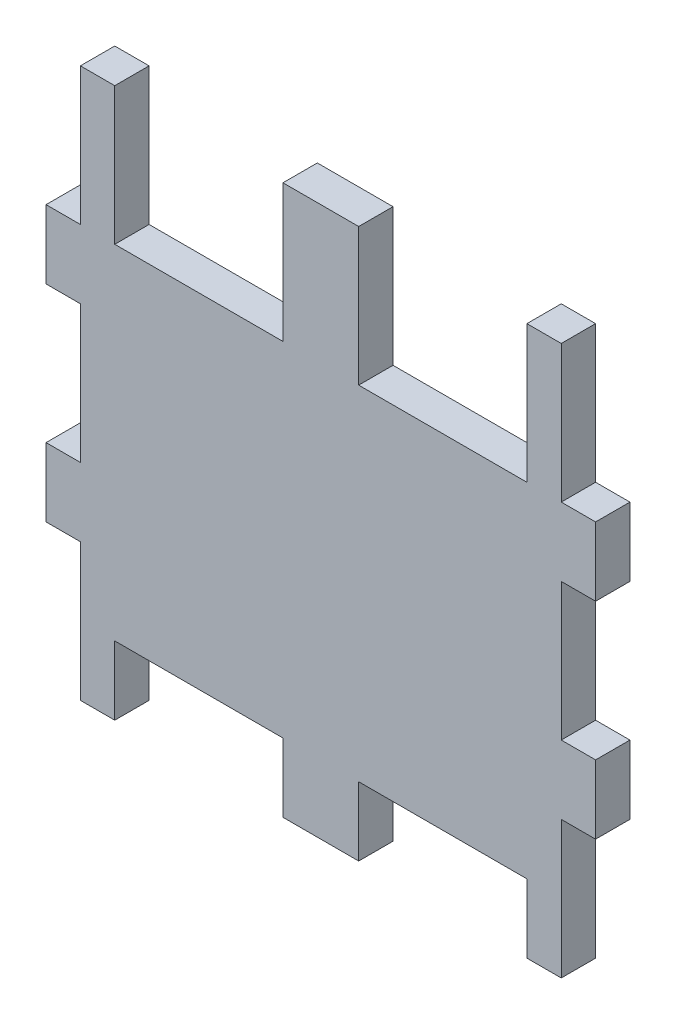
ISO-10303-21;
HEADER;
FILE_DESCRIPTION(('STEP AP214'),'2;1');
FILE_NAME('part.step','',(''),(''),'','','');
FILE_SCHEMA(('AUTOMOTIVE_DESIGN { 1 0 10303 214 1 1 1 1 }'));
ENDSEC;
DATA;
#1=APPLICATION_CONTEXT('core data for automotive mechanical design processes');
#2=APPLICATION_PROTOCOL_DEFINITION('international standard','automotive_design',2000,#1);
#3=PRODUCT_CONTEXT('',#1,'mechanical');
#4=PRODUCT('Part','Part','',(#3));
#5=PRODUCT_RELATED_PRODUCT_CATEGORY('part','',(#4));
#6=PRODUCT_DEFINITION_FORMATION('','',#4);
#7=PRODUCT_DEFINITION_CONTEXT('part definition',#1,'design');
#8=PRODUCT_DEFINITION('design','',#6,#7);
#9=PRODUCT_DEFINITION_SHAPE('','',#8);
#10=(LENGTH_UNIT() NAMED_UNIT(*) SI_UNIT(.MILLI.,.METRE.));
#11=(NAMED_UNIT(*) PLANE_ANGLE_UNIT() SI_UNIT($,.RADIAN.));
#12=(NAMED_UNIT(*) SI_UNIT($,.STERADIAN.) SOLID_ANGLE_UNIT());
#13=UNCERTAINTY_MEASURE_WITH_UNIT(LENGTH_MEASURE(1.E-05),#10,'distance_accuracy_value','');
#14=(GEOMETRIC_REPRESENTATION_CONTEXT(3) GLOBAL_UNCERTAINTY_ASSIGNED_CONTEXT((#13)) GLOBAL_UNIT_ASSIGNED_CONTEXT((#10,
#11,#12)) REPRESENTATION_CONTEXT('',''));
#15=CARTESIAN_POINT('',(0.,0.,0.));
#16=DIRECTION('',(0.,0.,1.));
#17=DIRECTION('',(1.,0.,0.));
#18=AXIS2_PLACEMENT_3D('',#15,#16,#17);
#19=CARTESIAN_POINT('',(50.8,50.8,6.35));
#20=DIRECTION('',(0.,0.,-1.));
#21=DIRECTION('',(-1.,0.,0.));
#22=AXIS2_PLACEMENT_3D('',#19,#20,#21);
#23=PLANE('',#22);
#24=DIRECTION('',(0.,1.,0.));
#25=VECTOR('',#24,1.);
#26=CARTESIAN_POINT('',(-38.0999999999999,-111.92459027123,6.35));
#27=LINE('',#26,#25);
#28=CARTESIAN_POINT('',(-38.0999999999999,-50.8,6.35));
#29=VERTEX_POINT('',#28);
#30=CARTESIAN_POINT('',(-38.0999999999999,-38.1,6.35));
#31=VERTEX_POINT('',#30);
#32=EDGE_CURVE('E289',#29,#31,#27,.T.);
#33=ORIENTED_EDGE('',*,*,#32,.T.);
#34=DIRECTION('',(1.,0.,0.));
#35=VECTOR('',#34,1.);
#36=CARTESIAN_POINT('',(0.,-38.1,6.35));
#37=LINE('',#36,#35);
#38=CARTESIAN_POINT('',(-7.00048629462658,-38.1,6.35));
#39=VERTEX_POINT('',#38);
#40=EDGE_CURVE('E292',#31,#39,#37,.T.);
#41=ORIENTED_EDGE('',*,*,#40,.T.);
#42=DIRECTION('',(-7.87514600396074E-05,0.999999996899104,0.));
#43=VECTOR('',#42,1.);
#44=CARTESIAN_POINT('',(-6.99467245695836,-111.925141111901,6.35));
#45=LINE('',#44,#43);
#46=CARTESIAN_POINT('',(-6.99948615108098,-50.8,6.35));
#47=VERTEX_POINT('',#46);
#48=EDGE_CURVE('E281',#47,#39,#45,.T.);
#49=ORIENTED_EDGE('',*,*,#48,.F.);
#50=DIRECTION('',(1.,0.,0.));
#51=VECTOR('',#50,1.);
#52=CARTESIAN_POINT('',(-50.8,-50.8,6.35));
#53=LINE('',#52,#51);
#54=CARTESIAN_POINT('',(6.99951370537342,-50.8,6.35));
#55=VERTEX_POINT('',#54);
#56=EDGE_CURVE('E41',#47,#55,#53,.T.);
#57=ORIENTED_EDGE('',*,*,#56,.T.);
#58=DIRECTION('',(0.,-1.,0.));
#59=VECTOR('',#58,1.);
#60=CARTESIAN_POINT('',(6.99951370537342,-111.92459027123,6.35));
#61=LINE('',#60,#59);
#62=CARTESIAN_POINT('',(6.99951370537342,-38.1,6.35));
#63=VERTEX_POINT('',#62);
#64=EDGE_CURVE('E307',#63,#55,#61,.T.);
#65=ORIENTED_EDGE('',*,*,#64,.F.);
#66=DIRECTION('',(1.,0.,0.));
#67=VECTOR('',#66,1.);
#68=CARTESIAN_POINT('',(0.,-38.1,6.35));
#69=LINE('',#68,#67);
#70=CARTESIAN_POINT('',(38.1000006310228,-38.1,6.35));
#71=VERTEX_POINT('',#70);
#72=EDGE_CURVE('E314',#63,#71,#69,.T.);
#73=ORIENTED_EDGE('',*,*,#72,.T.);
#74=DIRECTION('',(0.,-1.,0.));
#75=VECTOR('',#74,1.);
#76=CARTESIAN_POINT('',(38.1000006310229,-111.92459027123,6.35));
#77=LINE('',#76,#75);
#78=CARTESIAN_POINT('',(38.1000006310228,-50.8,6.35));
#79=VERTEX_POINT('',#78);
#80=EDGE_CURVE('E301',#71,#79,#77,.T.);
#81=ORIENTED_EDGE('',*,*,#80,.T.);
#82=CARTESIAN_POINT('',(44.4500267403425,-50.8,6.35));
#83=VERTEX_POINT('',#82);
#84=EDGE_CURVE('E43',#79,#83,#53,.T.);
#85=ORIENTED_EDGE('',*,*,#84,.T.);
#86=DIRECTION('',(0.,-1.,0.));
#87=VECTOR('',#86,1.);
#88=CARTESIAN_POINT('',(44.4500267403424,-111.924590271231,6.35));
#89=LINE('',#88,#87);
#90=CARTESIAN_POINT('',(44.4500267403425,-25.4000000787628,6.35));
#91=VERTEX_POINT('',#90);
#92=EDGE_CURVE('E330',#91,#83,#89,.T.);
#93=ORIENTED_EDGE('',*,*,#92,.F.);
#94=DIRECTION('',(1.,0.,0.));
#95=VECTOR('',#94,1.);
#96=CARTESIAN_POINT('',(0.,-25.4000000787628,6.35));
#97=LINE('',#96,#95);
#98=CARTESIAN_POINT('',(50.8,-25.4000000787628,6.35));
#99=VERTEX_POINT('',#98);
#100=EDGE_CURVE('E320',#91,#99,#97,.T.);
#101=ORIENTED_EDGE('',*,*,#100,.T.);
#102=DIRECTION('',(0.,1.,0.));
#103=VECTOR('',#102,1.);
#104=CARTESIAN_POINT('',(50.8,-50.8,6.35));
#105=LINE('',#104,#103);
#106=CARTESIAN_POINT('',(50.8,-12.7000000787628,6.35));
#107=VERTEX_POINT('',#106);
#108=EDGE_CURVE('E504',#99,#107,#105,.T.);
#109=ORIENTED_EDGE('',*,*,#108,.T.);
#110=DIRECTION('',(1.,0.,0.));
#111=VECTOR('',#110,1.);
#112=CARTESIAN_POINT('',(0.,-12.7000000787628,6.35));
#113=LINE('',#112,#111);
#114=CARTESIAN_POINT('',(44.4500267403425,-12.7000000787628,6.35));
#115=VERTEX_POINT('',#114);
#116=EDGE_CURVE('E356',#115,#107,#113,.T.);
#117=ORIENTED_EDGE('',*,*,#116,.F.);
#118=DIRECTION('',(0.,1.,0.));
#119=VECTOR('',#118,1.);
#120=CARTESIAN_POINT('',(44.4500267403425,-111.92459027123,6.35));
#121=LINE('',#120,#119);
#122=CARTESIAN_POINT('',(44.4500267403425,12.7,6.35));
#123=VERTEX_POINT('',#122);
#124=EDGE_CURVE('E341',#115,#123,#121,.T.);
#125=ORIENTED_EDGE('',*,*,#124,.T.);
#126=DIRECTION('',(1.,0.,0.));
#127=VECTOR('',#126,1.);
#128=CARTESIAN_POINT('',(0.,12.7,6.35));
#129=LINE('',#128,#127);
#130=CARTESIAN_POINT('',(50.8,12.7,6.35));
#131=VERTEX_POINT('',#130);
#132=EDGE_CURVE('E348',#123,#131,#129,.T.);
#133=ORIENTED_EDGE('',*,*,#132,.T.);
#134=CARTESIAN_POINT('',(50.8,25.4,6.35));
#135=VERTEX_POINT('',#134);
#136=EDGE_CURVE('E507',#131,#135,#105,.T.);
#137=ORIENTED_EDGE('',*,*,#136,.T.);
#138=DIRECTION('',(-1.,0.,0.));
#139=VECTOR('',#138,1.);
#140=CARTESIAN_POINT('',(0.,25.4,6.35));
#141=LINE('',#140,#139);
#142=CARTESIAN_POINT('',(44.4500267403425,25.4,6.35));
#143=VERTEX_POINT('',#142);
#144=EDGE_CURVE('E375',#135,#143,#141,.T.);
#145=ORIENTED_EDGE('',*,*,#144,.T.);
#146=DIRECTION('',(0.,-1.,0.));
#147=VECTOR('',#146,1.);
#148=CARTESIAN_POINT('',(44.4500267403427,-111.92459027123,6.35));
#149=LINE('',#148,#147);
#150=CARTESIAN_POINT('',(44.4500267403425,50.8,6.35));
#151=VERTEX_POINT('',#150);
#152=EDGE_CURVE('E364',#151,#143,#149,.T.);
#153=ORIENTED_EDGE('',*,*,#152,.F.);
#154=DIRECTION('',(-1.,0.,0.));
#155=VECTOR('',#154,1.);
#156=CARTESIAN_POINT('',(-50.8,50.8,6.35));
#157=LINE('',#156,#155);
#158=CARTESIAN_POINT('',(38.100053480685,50.8,6.35));
#159=VERTEX_POINT('',#158);
#160=EDGE_CURVE('E508',#151,#159,#157,.T.);
#161=ORIENTED_EDGE('',*,*,#160,.T.);
#162=DIRECTION('',(0.,-1.,0.));
#163=VECTOR('',#162,1.);
#164=CARTESIAN_POINT('',(38.100053480685,-111.92459027123,6.35));
#165=LINE('',#164,#163);
#166=CARTESIAN_POINT('',(38.100053480685,25.4,6.35));
#167=VERTEX_POINT('',#166);
#168=EDGE_CURVE('E481',#159,#167,#165,.T.);
#169=ORIENTED_EDGE('',*,*,#168,.T.);
#170=DIRECTION('',(1.,0.,0.));
#171=VECTOR('',#170,1.);
#172=CARTESIAN_POINT('',(0.,25.4,6.35));
#173=LINE('',#172,#171);
#174=CARTESIAN_POINT('',(7.00000000000002,25.4,6.35));
#175=VERTEX_POINT('',#174);
#176=EDGE_CURVE('E490',#175,#167,#173,.T.);
#177=ORIENTED_EDGE('',*,*,#176,.F.);
#178=DIRECTION('',(0.,-1.,0.));
#179=VECTOR('',#178,1.);
#180=CARTESIAN_POINT('',(7.00000000000016,-111.92459027123,6.35));
#181=LINE('',#180,#179);
#182=CARTESIAN_POINT('',(7.,50.8,6.35));
#183=VERTEX_POINT('',#182);
#184=EDGE_CURVE('E470',#183,#175,#181,.T.);
#185=ORIENTED_EDGE('',*,*,#184,.F.);
#186=CARTESIAN_POINT('',(-7.,50.8,6.35));
#187=VERTEX_POINT('',#186);
#188=EDGE_CURVE('E511',#183,#187,#157,.T.);
#189=ORIENTED_EDGE('',*,*,#188,.T.);
#190=DIRECTION('',(0.,-1.,0.));
#191=VECTOR('',#190,1.);
#192=CARTESIAN_POINT('',(-7.00000000000014,-111.92459027123,6.35));
#193=LINE('',#192,#191);
#194=CARTESIAN_POINT('',(-7.00000000000002,25.4,6.35));
#195=VERTEX_POINT('',#194);
#196=EDGE_CURVE('E454',#187,#195,#193,.T.);
#197=ORIENTED_EDGE('',*,*,#196,.T.);
#198=DIRECTION('',(1.,0.,0.));
#199=VECTOR('',#198,1.);
#200=CARTESIAN_POINT('',(0.,25.4,6.35));
#201=LINE('',#200,#199);
#202=CARTESIAN_POINT('',(-38.1,25.4,6.35));
#203=VERTEX_POINT('',#202);
#204=EDGE_CURVE('E463',#203,#195,#201,.T.);
#205=ORIENTED_EDGE('',*,*,#204,.F.);
#206=DIRECTION('',(0.,-1.,0.));
#207=VECTOR('',#206,1.);
#208=CARTESIAN_POINT('',(-38.0999999999998,-111.924590271231,6.35));
#209=LINE('',#208,#207);
#210=CARTESIAN_POINT('',(-38.1,50.8,6.35));
#211=VERTEX_POINT('',#210);
#212=EDGE_CURVE('E445',#211,#203,#209,.T.);
#213=ORIENTED_EDGE('',*,*,#212,.F.);
#214=CARTESIAN_POINT('',(-44.45,50.8,6.35));
#215=VERTEX_POINT('',#214);
#216=EDGE_CURVE('E506',#211,#215,#157,.T.);
#217=ORIENTED_EDGE('',*,*,#216,.T.);
#218=DIRECTION('',(0.,-1.,0.));
#219=VECTOR('',#218,1.);
#220=CARTESIAN_POINT('',(-44.45,-111.92459027123,6.35));
#221=LINE('',#220,#219);
#222=CARTESIAN_POINT('',(-44.45,25.4,6.35));
#223=VERTEX_POINT('',#222);
#224=EDGE_CURVE('E424',#215,#223,#221,.T.);
#225=ORIENTED_EDGE('',*,*,#224,.T.);
#226=DIRECTION('',(1.,0.,0.));
#227=VECTOR('',#226,1.);
#228=CARTESIAN_POINT('',(0.,25.4,6.35));
#229=LINE('',#228,#227);
#230=CARTESIAN_POINT('',(-50.8,25.4,6.35));
#231=VERTEX_POINT('',#230);
#232=EDGE_CURVE('E435',#231,#223,#229,.T.);
#233=ORIENTED_EDGE('',*,*,#232,.F.);
#234=DIRECTION('',(0.,-1.,0.));
#235=VECTOR('',#234,1.);
#236=CARTESIAN_POINT('',(-50.8,-50.8,6.35));
#237=LINE('',#236,#235);
#238=CARTESIAN_POINT('',(-50.8,12.7,6.35));
#239=VERTEX_POINT('',#238);
#240=EDGE_CURVE('E512',#231,#239,#237,.T.);
#241=ORIENTED_EDGE('',*,*,#240,.T.);
#242=DIRECTION('',(-1.,0.,0.));
#243=VECTOR('',#242,1.);
#244=CARTESIAN_POINT('',(0.,12.7,6.35));
#245=LINE('',#244,#243);
#246=CARTESIAN_POINT('',(-44.45,12.7,6.35));
#247=VERTEX_POINT('',#246);
#248=EDGE_CURVE('E418',#247,#239,#245,.T.);
#249=ORIENTED_EDGE('',*,*,#248,.F.);
#250=DIRECTION('',(0.,1.,0.));
#251=VECTOR('',#250,1.);
#252=CARTESIAN_POINT('',(-44.45,-111.92459027123,6.35));
#253=LINE('',#252,#251);
#254=CARTESIAN_POINT('',(-44.45,-12.7,6.35));
#255=VERTEX_POINT('',#254);
#256=EDGE_CURVE('E401',#255,#247,#253,.T.);
#257=ORIENTED_EDGE('',*,*,#256,.F.);
#258=DIRECTION('',(-1.,0.,0.));
#259=VECTOR('',#258,1.);
#260=CARTESIAN_POINT('',(0.,-12.7,6.35));
#261=LINE('',#260,#259);
#262=CARTESIAN_POINT('',(-50.8,-12.7,6.35));
#263=VERTEX_POINT('',#262);
#264=EDGE_CURVE('E410',#255,#263,#261,.T.);
#265=ORIENTED_EDGE('',*,*,#264,.T.);
#266=CARTESIAN_POINT('',(-50.8,-25.4,6.35));
#267=VERTEX_POINT('',#266);
#268=EDGE_CURVE('E510',#263,#267,#237,.T.);
#269=ORIENTED_EDGE('',*,*,#268,.T.);
#270=DIRECTION('',(1.,0.,0.));
#271=VECTOR('',#270,1.);
#272=CARTESIAN_POINT('',(0.,-25.4,6.35));
#273=LINE('',#272,#271);
#274=CARTESIAN_POINT('',(-44.45,-25.4,6.35));
#275=VERTEX_POINT('',#274);
#276=EDGE_CURVE('E392',#267,#275,#273,.T.);
#277=ORIENTED_EDGE('',*,*,#276,.T.);
#278=DIRECTION('',(0.,-1.,0.));
#279=VECTOR('',#278,1.);
#280=CARTESIAN_POINT('',(-44.45,-111.92459027123,6.35));
#281=LINE('',#280,#279);
#282=CARTESIAN_POINT('',(-44.45,-50.8,6.35));
#283=VERTEX_POINT('',#282);
#284=EDGE_CURVE('E385',#275,#283,#281,.T.);
#285=ORIENTED_EDGE('',*,*,#284,.T.);
#286=EDGE_CURVE('E11',#283,#29,#53,.T.);
#287=ORIENTED_EDGE('',*,*,#286,.T.);
#288=EDGE_LOOP('',(#33,#41,#49,#57,#65,#73,#81,#85,#93,#101,#109,#117,#125,#133,#137,#145,#153,
#161,#169,#177,#185,#189,#197,#205,#213,#217,#225,#233,#241,#249,#257,#265,#269,#277,#285,#287));
#289=FACE_BOUND('',#288,.T.);
#290=ADVANCED_FACE('F32',(#289),#23,.F.);
#291=CARTESIAN_POINT('',(50.8,50.8,0.));
#292=DIRECTION('',(0.,0.,-1.));
#293=DIRECTION('',(-1.,0.,0.));
#294=AXIS2_PLACEMENT_3D('',#291,#292,#293);
#295=PLANE('',#294);
#296=DIRECTION('',(1.,0.,0.));
#297=VECTOR('',#296,1.);
#298=CARTESIAN_POINT('',(0.,-38.1,0.));
#299=LINE('',#298,#297);
#300=CARTESIAN_POINT('',(-38.0999999999999,-38.1,0.));
#301=VERTEX_POINT('',#300);
#302=CARTESIAN_POINT('',(-7.00048629462658,-38.1,0.));
#303=VERTEX_POINT('',#302);
#304=EDGE_CURVE('E270',#301,#303,#299,.T.);
#305=ORIENTED_EDGE('',*,*,#304,.F.);
#306=DIRECTION('',(0.,1.,0.));
#307=VECTOR('',#306,1.);
#308=CARTESIAN_POINT('',(-38.0999999999999,-111.92459027123,0.));
#309=LINE('',#308,#307);
#310=CARTESIAN_POINT('',(-38.0999999999999,-50.8,0.));
#311=VERTEX_POINT('',#310);
#312=EDGE_CURVE('E278',#311,#301,#309,.T.);
#313=ORIENTED_EDGE('',*,*,#312,.F.);
#314=DIRECTION('',(1.,0.,0.));
#315=VECTOR('',#314,1.);
#316=CARTESIAN_POINT('',(-50.8,-50.8,0.));
#317=LINE('',#316,#315);
#318=CARTESIAN_POINT('',(-44.45,-50.8,0.));
#319=VERTEX_POINT('',#318);
#320=EDGE_CURVE('E36',#319,#311,#317,.T.);
#321=ORIENTED_EDGE('',*,*,#320,.F.);
#322=DIRECTION('',(0.,-1.,0.));
#323=VECTOR('',#322,1.);
#324=CARTESIAN_POINT('',(-44.45,-111.92459027123,0.));
#325=LINE('',#324,#323);
#326=CARTESIAN_POINT('',(-44.45,-25.4,0.));
#327=VERTEX_POINT('',#326);
#328=EDGE_CURVE('E389',#327,#319,#325,.T.);
#329=ORIENTED_EDGE('',*,*,#328,.F.);
#330=DIRECTION('',(1.,0.,0.));
#331=VECTOR('',#330,1.);
#332=CARTESIAN_POINT('',(0.,-25.4,0.));
#333=LINE('',#332,#331);
#334=CARTESIAN_POINT('',(-50.8,-25.4,0.));
#335=VERTEX_POINT('',#334);
#336=EDGE_CURVE('E391',#335,#327,#333,.T.);
#337=ORIENTED_EDGE('',*,*,#336,.F.);
#338=DIRECTION('',(0.,-1.,0.));
#339=VECTOR('',#338,1.);
#340=CARTESIAN_POINT('',(-50.8,-50.8,0.));
#341=LINE('',#340,#339);
#342=CARTESIAN_POINT('',(-50.8,-12.7,0.));
#343=VERTEX_POINT('',#342);
#344=EDGE_CURVE('E519',#343,#335,#341,.T.);
#345=ORIENTED_EDGE('',*,*,#344,.F.);
#346=DIRECTION('',(-1.,0.,0.));
#347=VECTOR('',#346,1.);
#348=CARTESIAN_POINT('',(0.,-12.7,0.));
#349=LINE('',#348,#347);
#350=CARTESIAN_POINT('',(-44.45,-12.7,0.));
#351=VERTEX_POINT('',#350);
#352=EDGE_CURVE('E413',#351,#343,#349,.T.);
#353=ORIENTED_EDGE('',*,*,#352,.F.);
#354=DIRECTION('',(0.,1.,0.));
#355=VECTOR('',#354,1.);
#356=CARTESIAN_POINT('',(-44.45,-111.92459027123,0.));
#357=LINE('',#356,#355);
#358=CARTESIAN_POINT('',(-44.45,12.7,0.));
#359=VERTEX_POINT('',#358);
#360=EDGE_CURVE('E406',#351,#359,#357,.T.);
#361=ORIENTED_EDGE('',*,*,#360,.T.);
#362=DIRECTION('',(-1.,0.,0.));
#363=VECTOR('',#362,1.);
#364=CARTESIAN_POINT('',(0.,12.7,0.));
#365=LINE('',#364,#363);
#366=CARTESIAN_POINT('',(-50.8,12.7,0.));
#367=VERTEX_POINT('',#366);
#368=EDGE_CURVE('E409',#359,#367,#365,.T.);
#369=ORIENTED_EDGE('',*,*,#368,.T.);
#370=CARTESIAN_POINT('',(-50.8,25.4,0.));
#371=VERTEX_POINT('',#370);
#372=EDGE_CURVE('E521',#371,#367,#341,.T.);
#373=ORIENTED_EDGE('',*,*,#372,.F.);
#374=DIRECTION('',(1.,0.,0.));
#375=VECTOR('',#374,1.);
#376=CARTESIAN_POINT('',(0.,25.4,0.));
#377=LINE('',#376,#375);
#378=CARTESIAN_POINT('',(-44.45,25.4,0.));
#379=VERTEX_POINT('',#378);
#380=EDGE_CURVE('E434',#371,#379,#377,.T.);
#381=ORIENTED_EDGE('',*,*,#380,.T.);
#382=DIRECTION('',(0.,-1.,0.));
#383=VECTOR('',#382,1.);
#384=CARTESIAN_POINT('',(-44.45,-111.92459027123,0.));
#385=LINE('',#384,#383);
#386=CARTESIAN_POINT('',(-44.45,50.8,0.));
#387=VERTEX_POINT('',#386);
#388=EDGE_CURVE('E431',#387,#379,#385,.T.);
#389=ORIENTED_EDGE('',*,*,#388,.F.);
#390=DIRECTION('',(-1.,0.,0.));
#391=VECTOR('',#390,1.);
#392=CARTESIAN_POINT('',(-50.8,50.8,0.));
#393=LINE('',#392,#391);
#394=CARTESIAN_POINT('',(-38.1,50.8,0.));
#395=VERTEX_POINT('',#394);
#396=EDGE_CURVE('E517',#395,#387,#393,.T.);
#397=ORIENTED_EDGE('',*,*,#396,.F.);
#398=DIRECTION('',(0.,-1.,0.));
#399=VECTOR('',#398,1.);
#400=CARTESIAN_POINT('',(-38.0999999999998,-111.924590271231,0.));
#401=LINE('',#400,#399);
#402=CARTESIAN_POINT('',(-38.1,25.4,0.));
#403=VERTEX_POINT('',#402);
#404=EDGE_CURVE('E450',#395,#403,#401,.T.);
#405=ORIENTED_EDGE('',*,*,#404,.T.);
#406=DIRECTION('',(1.,0.,0.));
#407=VECTOR('',#406,1.);
#408=CARTESIAN_POINT('',(0.,25.4,0.));
#409=LINE('',#408,#407);
#410=CARTESIAN_POINT('',(-7.00000000000003,25.4,0.));
#411=VERTEX_POINT('',#410);
#412=EDGE_CURVE('E453',#403,#411,#409,.T.);
#413=ORIENTED_EDGE('',*,*,#412,.T.);
#414=DIRECTION('',(0.,-1.,0.));
#415=VECTOR('',#414,1.);
#416=CARTESIAN_POINT('',(-7.00000000000014,-111.92459027123,0.));
#417=LINE('',#416,#415);
#418=CARTESIAN_POINT('',(-7.,50.8,0.));
#419=VERTEX_POINT('',#418);
#420=EDGE_CURVE('E457',#419,#411,#417,.T.);
#421=ORIENTED_EDGE('',*,*,#420,.F.);
#422=CARTESIAN_POINT('',(7.,50.8,0.));
#423=VERTEX_POINT('',#422);
#424=EDGE_CURVE('E520',#423,#419,#393,.T.);
#425=ORIENTED_EDGE('',*,*,#424,.F.);
#426=DIRECTION('',(0.,-1.,0.));
#427=VECTOR('',#426,1.);
#428=CARTESIAN_POINT('',(7.00000000000016,-111.92459027123,0.));
#429=LINE('',#428,#427);
#430=CARTESIAN_POINT('',(7.00000000000002,25.4,0.));
#431=VERTEX_POINT('',#430);
#432=EDGE_CURVE('E477',#423,#431,#429,.T.);
#433=ORIENTED_EDGE('',*,*,#432,.T.);
#434=DIRECTION('',(1.,0.,0.));
#435=VECTOR('',#434,1.);
#436=CARTESIAN_POINT('',(0.,25.4,0.));
#437=LINE('',#436,#435);
#438=CARTESIAN_POINT('',(38.100053480685,25.4,0.));
#439=VERTEX_POINT('',#438);
#440=EDGE_CURVE('E480',#431,#439,#437,.T.);
#441=ORIENTED_EDGE('',*,*,#440,.T.);
#442=DIRECTION('',(0.,-1.,0.));
#443=VECTOR('',#442,1.);
#444=CARTESIAN_POINT('',(38.100053480685,-111.92459027123,0.));
#445=LINE('',#444,#443);
#446=CARTESIAN_POINT('',(38.100053480685,50.8,0.));
#447=VERTEX_POINT('',#446);
#448=EDGE_CURVE('E484',#447,#439,#445,.T.);
#449=ORIENTED_EDGE('',*,*,#448,.F.);
#450=CARTESIAN_POINT('',(44.4500267403425,50.8,0.));
#451=VERTEX_POINT('',#450);
#452=EDGE_CURVE('E518',#451,#447,#393,.T.);
#453=ORIENTED_EDGE('',*,*,#452,.F.);
#454=DIRECTION('',(0.,-1.,0.));
#455=VECTOR('',#454,1.);
#456=CARTESIAN_POINT('',(44.4500267403427,-111.92459027123,0.));
#457=LINE('',#456,#455);
#458=CARTESIAN_POINT('',(44.4500267403425,25.4,0.));
#459=VERTEX_POINT('',#458);
#460=EDGE_CURVE('E371',#451,#459,#457,.T.);
#461=ORIENTED_EDGE('',*,*,#460,.T.);
#462=DIRECTION('',(-1.,0.,0.));
#463=VECTOR('',#462,1.);
#464=CARTESIAN_POINT('',(0.,25.4,0.));
#465=LINE('',#464,#463);
#466=CARTESIAN_POINT('',(50.8,25.4,0.));
#467=VERTEX_POINT('',#466);
#468=EDGE_CURVE('E374',#467,#459,#465,.T.);
#469=ORIENTED_EDGE('',*,*,#468,.F.);
#470=DIRECTION('',(0.,1.,0.));
#471=VECTOR('',#470,1.);
#472=CARTESIAN_POINT('',(50.8,-50.8,0.));
#473=LINE('',#472,#471);
#474=CARTESIAN_POINT('',(50.8,12.7,0.));
#475=VERTEX_POINT('',#474);
#476=EDGE_CURVE('E497',#475,#467,#473,.T.);
#477=ORIENTED_EDGE('',*,*,#476,.F.);
#478=DIRECTION('',(1.,0.,0.));
#479=VECTOR('',#478,1.);
#480=CARTESIAN_POINT('',(0.,12.7,0.));
#481=LINE('',#480,#479);
#482=CARTESIAN_POINT('',(44.4500267403425,12.7,0.));
#483=VERTEX_POINT('',#482);
#484=EDGE_CURVE('E351',#483,#475,#481,.T.);
#485=ORIENTED_EDGE('',*,*,#484,.F.);
#486=DIRECTION('',(0.,1.,0.));
#487=VECTOR('',#486,1.);
#488=CARTESIAN_POINT('',(44.4500267403425,-111.92459027123,0.));
#489=LINE('',#488,#487);
#490=CARTESIAN_POINT('',(44.4500267403425,-12.7000000787628,0.));
#491=VERTEX_POINT('',#490);
#492=EDGE_CURVE('E345',#491,#483,#489,.T.);
#493=ORIENTED_EDGE('',*,*,#492,.F.);
#494=DIRECTION('',(1.,0.,0.));
#495=VECTOR('',#494,1.);
#496=CARTESIAN_POINT('',(0.,-12.7000000787628,0.));
#497=LINE('',#496,#495);
#498=CARTESIAN_POINT('',(50.8,-12.7000000787628,0.));
#499=VERTEX_POINT('',#498);
#500=EDGE_CURVE('E347',#491,#499,#497,.T.);
#501=ORIENTED_EDGE('',*,*,#500,.T.);
#502=CARTESIAN_POINT('',(50.8,-25.4000000787628,0.));
#503=VERTEX_POINT('',#502);
#504=EDGE_CURVE('E515',#503,#499,#473,.T.);
#505=ORIENTED_EDGE('',*,*,#504,.F.);
#506=DIRECTION('',(1.,0.,0.));
#507=VECTOR('',#506,1.);
#508=CARTESIAN_POINT('',(0.,-25.4000000787628,0.));
#509=LINE('',#508,#507);
#510=CARTESIAN_POINT('',(44.4500267403425,-25.4000000787628,0.));
#511=VERTEX_POINT('',#510);
#512=EDGE_CURVE('E327',#511,#503,#509,.T.);
#513=ORIENTED_EDGE('',*,*,#512,.F.);
#514=DIRECTION('',(0.,-1.,0.));
#515=VECTOR('',#514,1.);
#516=CARTESIAN_POINT('',(44.4500267403424,-111.924590271231,0.));
#517=LINE('',#516,#515);
#518=CARTESIAN_POINT('',(44.4500267403425,-50.8,0.));
#519=VERTEX_POINT('',#518);
#520=EDGE_CURVE('E329',#511,#519,#517,.T.);
#521=ORIENTED_EDGE('',*,*,#520,.T.);
#522=CARTESIAN_POINT('',(38.1000006310228,-50.8,0.));
#523=VERTEX_POINT('',#522);
#524=EDGE_CURVE('E523',#523,#519,#317,.T.);
#525=ORIENTED_EDGE('',*,*,#524,.F.);
#526=DIRECTION('',(0.,-1.,0.));
#527=VECTOR('',#526,1.);
#528=CARTESIAN_POINT('',(38.1000006310229,-111.92459027123,0.));
#529=LINE('',#528,#527);
#530=CARTESIAN_POINT('',(38.1000006310228,-38.1,0.));
#531=VERTEX_POINT('',#530);
#532=EDGE_CURVE('E304',#531,#523,#529,.T.);
#533=ORIENTED_EDGE('',*,*,#532,.F.);
#534=DIRECTION('',(1.,0.,0.));
#535=VECTOR('',#534,1.);
#536=CARTESIAN_POINT('',(0.,-38.1,0.));
#537=LINE('',#536,#535);
#538=CARTESIAN_POINT('',(6.99951370537342,-38.1,0.));
#539=VERTEX_POINT('',#538);
#540=EDGE_CURVE('E306',#539,#531,#537,.T.);
#541=ORIENTED_EDGE('',*,*,#540,.F.);
#542=DIRECTION('',(0.,-1.,0.));
#543=VECTOR('',#542,1.);
#544=CARTESIAN_POINT('',(6.99951370537342,-111.92459027123,0.));
#545=LINE('',#544,#543);
#546=CARTESIAN_POINT('',(6.99951370537342,-50.8,0.));
#547=VERTEX_POINT('',#546);
#548=EDGE_CURVE('E309',#539,#547,#545,.T.);
#549=ORIENTED_EDGE('',*,*,#548,.T.);
#550=CARTESIAN_POINT('',(-6.99948615108098,-50.8,0.));
#551=VERTEX_POINT('',#550);
#552=EDGE_CURVE('E288',#551,#547,#317,.T.);
#553=ORIENTED_EDGE('',*,*,#552,.F.);
#554=DIRECTION('',(-7.87514600396074E-05,0.999999996899104,0.));
#555=VECTOR('',#554,1.);
#556=CARTESIAN_POINT('',(-6.99467245695836,-111.925141111901,0.));
#557=LINE('',#556,#555);
#558=EDGE_CURVE('E50',#551,#303,#557,.T.);
#559=ORIENTED_EDGE('',*,*,#558,.T.);
#560=EDGE_LOOP('',(#305,#313,#321,#329,#337,#345,#353,#361,#369,#373,#381,#389,#397,#405,#413,
#421,#425,#433,#441,#449,#453,#461,#469,#477,#485,#493,#501,#505,#513,#521,#525,#533,#541,#549,
#553,#559));
#561=FACE_BOUND('',#560,.T.);
#562=ADVANCED_FACE('F286',(#561),#295,.T.);
#563=CARTESIAN_POINT('',(-50.8,-50.8,6.35));
#564=DIRECTION('',(0.,1.,0.));
#565=DIRECTION('',(0.,0.,1.));
#566=AXIS2_PLACEMENT_3D('',#563,#564,#565);
#567=PLANE('',#566);
#568=DIRECTION('',(0.,0.,1.));
#569=VECTOR('',#568,1.);
#570=CARTESIAN_POINT('',(-38.0999999999999,-50.8,0.));
#571=LINE('',#570,#569);
#572=EDGE_CURVE('E298',#311,#29,#571,.T.);
#573=ORIENTED_EDGE('',*,*,#572,.T.);
#574=ORIENTED_EDGE('',*,*,#286,.F.);
#575=DIRECTION('',(0.,0.,1.));
#576=VECTOR('',#575,1.);
#577=CARTESIAN_POINT('',(-44.45,-50.8,0.));
#578=LINE('',#577,#576);
#579=EDGE_CURVE('E399',#319,#283,#578,.T.);
#580=ORIENTED_EDGE('',*,*,#579,.F.);
#581=ORIENTED_EDGE('',*,*,#320,.T.);
#582=EDGE_LOOP('',(#573,#574,#580,#581));
#583=FACE_BOUND('',#582,.T.);
#584=ADVANCED_FACE('F605',(#583),#567,.F.);
#585=DIRECTION('',(0.,0.,1.));
#586=VECTOR('',#585,1.);
#587=CARTESIAN_POINT('',(38.1000006310228,-50.8,0.));
#588=LINE('',#587,#586);
#589=EDGE_CURVE('E318',#523,#79,#588,.T.);
#590=ORIENTED_EDGE('',*,*,#589,.F.);
#591=ORIENTED_EDGE('',*,*,#524,.T.);
#592=DIRECTION('',(0.,0.,1.));
#593=VECTOR('',#592,1.);
#594=CARTESIAN_POINT('',(44.4500267403425,-50.8,0.));
#595=LINE('',#594,#593);
#596=EDGE_CURVE('E338',#519,#83,#595,.T.);
#597=ORIENTED_EDGE('',*,*,#596,.T.);
#598=ORIENTED_EDGE('',*,*,#84,.F.);
#599=EDGE_LOOP('',(#590,#591,#597,#598));
#600=FACE_BOUND('',#599,.T.);
#601=ADVANCED_FACE('F615',(#600),#567,.F.);
#602=CARTESIAN_POINT('',(50.8,-50.8,6.35));
#603=DIRECTION('',(-1.,0.,0.));
#604=DIRECTION('',(0.,0.,1.));
#605=AXIS2_PLACEMENT_3D('',#602,#603,#604);
#606=PLANE('',#605);
#607=DIRECTION('',(0.,0.,1.));
#608=VECTOR('',#607,1.);
#609=CARTESIAN_POINT('',(50.8,-25.4000000787628,0.));
#610=LINE('',#609,#608);
#611=EDGE_CURVE('E333',#503,#99,#610,.T.);
#612=ORIENTED_EDGE('',*,*,#611,.F.);
#613=ORIENTED_EDGE('',*,*,#504,.T.);
#614=DIRECTION('',(0.,0.,1.));
#615=VECTOR('',#614,1.);
#616=CARTESIAN_POINT('',(50.8,-12.7000000787628,0.));
#617=LINE('',#616,#615);
#618=EDGE_CURVE('E367',#499,#107,#617,.T.);
#619=ORIENTED_EDGE('',*,*,#618,.T.);
#620=ORIENTED_EDGE('',*,*,#108,.F.);
#621=EDGE_LOOP('',(#612,#613,#619,#620));
#622=FACE_BOUND('',#621,.T.);
#623=ADVANCED_FACE('F34',(#622),#606,.F.);
#624=DIRECTION('',(0.,0.,1.));
#625=VECTOR('',#624,1.);
#626=CARTESIAN_POINT('',(50.8,12.7,0.));
#627=LINE('',#626,#625);
#628=EDGE_CURVE('E365',#475,#131,#627,.T.);
#629=ORIENTED_EDGE('',*,*,#628,.F.);
#630=ORIENTED_EDGE('',*,*,#476,.T.);
#631=DIRECTION('',(0.,0.,1.));
#632=VECTOR('',#631,1.);
#633=CARTESIAN_POINT('',(50.8,25.4,0.));
#634=LINE('',#633,#632);
#635=EDGE_CURVE('E382',#467,#135,#634,.T.);
#636=ORIENTED_EDGE('',*,*,#635,.T.);
#637=ORIENTED_EDGE('',*,*,#136,.F.);
#638=EDGE_LOOP('',(#629,#630,#636,#637));
#639=FACE_BOUND('',#638,.T.);
#640=ADVANCED_FACE('F889',(#639),#606,.F.);
#641=CARTESIAN_POINT('',(-50.8,-50.8,6.35));
#642=DIRECTION('',(1.,0.,0.));
#643=DIRECTION('',(0.,0.,-1.));
#644=AXIS2_PLACEMENT_3D('',#641,#642,#643);
#645=PLANE('',#644);
#646=DIRECTION('',(0.,0.,1.));
#647=VECTOR('',#646,1.);
#648=CARTESIAN_POINT('',(-50.8,-25.4,0.));
#649=LINE('',#648,#647);
#650=EDGE_CURVE('E402',#335,#267,#649,.T.);
#651=ORIENTED_EDGE('',*,*,#650,.T.);
#652=ORIENTED_EDGE('',*,*,#268,.F.);
#653=DIRECTION('',(0.,0.,1.));
#654=VECTOR('',#653,1.);
#655=CARTESIAN_POINT('',(-50.8,-12.7,0.));
#656=LINE('',#655,#654);
#657=EDGE_CURVE('E425',#343,#263,#656,.T.);
#658=ORIENTED_EDGE('',*,*,#657,.F.);
#659=ORIENTED_EDGE('',*,*,#344,.T.);
#660=EDGE_LOOP('',(#651,#652,#658,#659));
#661=FACE_BOUND('',#660,.T.);
#662=ADVANCED_FACE('F531',(#661),#645,.F.);
#663=ORIENTED_EDGE('',*,*,#56,.F.);
#664=DIRECTION('',(0.,0.,1.));
#665=VECTOR('',#664,1.);
#666=CARTESIAN_POINT('',(-6.99948615108098,-50.8,0.));
#667=LINE('',#666,#665);
#668=EDGE_CURVE('E283',#551,#47,#667,.T.);
#669=ORIENTED_EDGE('',*,*,#668,.F.);
#670=ORIENTED_EDGE('',*,*,#552,.T.);
#671=DIRECTION('',(0.,0.,1.));
#672=VECTOR('',#671,1.);
#673=CARTESIAN_POINT('',(6.99951370537342,-50.8,0.));
#674=LINE('',#673,#672);
#675=EDGE_CURVE('E321',#547,#55,#674,.T.);
#676=ORIENTED_EDGE('',*,*,#675,.T.);
#677=EDGE_LOOP('',(#663,#669,#670,#676));
#678=FACE_BOUND('',#677,.T.);
#679=ADVANCED_FACE('F611',(#678),#567,.F.);
#680=CARTESIAN_POINT('',(-50.8,50.8,6.35));
#681=DIRECTION('',(0.,-1.,0.));
#682=DIRECTION('',(0.,0.,-1.));
#683=AXIS2_PLACEMENT_3D('',#680,#681,#682);
#684=PLANE('',#683);
#685=DIRECTION('',(0.,0.,1.));
#686=VECTOR('',#685,1.);
#687=CARTESIAN_POINT('',(-44.45,50.8,0.));
#688=LINE('',#687,#686);
#689=EDGE_CURVE('E438',#387,#215,#688,.T.);
#690=ORIENTED_EDGE('',*,*,#689,.T.);
#691=ORIENTED_EDGE('',*,*,#216,.F.);
#692=DIRECTION('',(0.,0.,1.));
#693=VECTOR('',#692,1.);
#694=CARTESIAN_POINT('',(-38.1,50.8,0.));
#695=LINE('',#694,#693);
#696=EDGE_CURVE('E468',#395,#211,#695,.T.);
#697=ORIENTED_EDGE('',*,*,#696,.F.);
#698=ORIENTED_EDGE('',*,*,#396,.T.);
#699=EDGE_LOOP('',(#690,#691,#697,#698));
#700=FACE_BOUND('',#699,.T.);
#701=ADVANCED_FACE('F569',(#700),#684,.F.);
#702=DIRECTION('',(0.,0.,1.));
#703=VECTOR('',#702,1.);
#704=CARTESIAN_POINT('',(-7.,50.8,0.));
#705=LINE('',#704,#703);
#706=EDGE_CURVE('E471',#419,#187,#705,.T.);
#707=ORIENTED_EDGE('',*,*,#706,.T.);
#708=ORIENTED_EDGE('',*,*,#188,.F.);
#709=DIRECTION('',(0.,0.,1.));
#710=VECTOR('',#709,1.);
#711=CARTESIAN_POINT('',(7.,50.8,0.));
#712=LINE('',#711,#710);
#713=EDGE_CURVE('E495',#423,#183,#712,.T.);
#714=ORIENTED_EDGE('',*,*,#713,.F.);
#715=ORIENTED_EDGE('',*,*,#424,.T.);
#716=EDGE_LOOP('',(#707,#708,#714,#715));
#717=FACE_BOUND('',#716,.T.);
#718=ADVANCED_FACE('F575',(#717),#684,.F.);
#719=ORIENTED_EDGE('',*,*,#160,.F.);
#720=DIRECTION('',(0.,0.,1.));
#721=VECTOR('',#720,1.);
#722=CARTESIAN_POINT('',(44.4500267403425,50.8,0.));
#723=LINE('',#722,#721);
#724=EDGE_CURVE('E377',#451,#151,#723,.T.);
#725=ORIENTED_EDGE('',*,*,#724,.F.);
#726=ORIENTED_EDGE('',*,*,#452,.T.);
#727=DIRECTION('',(0.,0.,1.));
#728=VECTOR('',#727,1.);
#729=CARTESIAN_POINT('',(38.100053480685,50.8,0.));
#730=LINE('',#729,#728);
#731=EDGE_CURVE('E498',#447,#159,#730,.T.);
#732=ORIENTED_EDGE('',*,*,#731,.T.);
#733=EDGE_LOOP('',(#719,#725,#726,#732));
#734=FACE_BOUND('',#733,.T.);
#735=ADVANCED_FACE('F617',(#734),#684,.F.);
#736=ORIENTED_EDGE('',*,*,#372,.T.);
#737=DIRECTION('',(0.,0.,1.));
#738=VECTOR('',#737,1.);
#739=CARTESIAN_POINT('',(-50.8,12.7,0.));
#740=LINE('',#739,#738);
#741=EDGE_CURVE('E427',#367,#239,#740,.T.);
#742=ORIENTED_EDGE('',*,*,#741,.T.);
#743=ORIENTED_EDGE('',*,*,#240,.F.);
#744=DIRECTION('',(0.,0.,1.));
#745=VECTOR('',#744,1.);
#746=CARTESIAN_POINT('',(-50.8,25.4,0.));
#747=LINE('',#746,#745);
#748=EDGE_CURVE('E446',#371,#231,#747,.T.);
#749=ORIENTED_EDGE('',*,*,#748,.F.);
#750=EDGE_LOOP('',(#736,#742,#743,#749));
#751=FACE_BOUND('',#750,.T.);
#752=ADVANCED_FACE('F558',(#751),#645,.F.);
#753=CARTESIAN_POINT('',(7.00000000000016,-111.92459027123,0.));
#754=DIRECTION('',(-1.,0.,0.));
#755=DIRECTION('',(0.,-1.,0.));
#756=AXIS2_PLACEMENT_3D('',#753,#754,#755);
#757=PLANE('',#756);
#758=ORIENTED_EDGE('',*,*,#184,.T.);
#759=DIRECTION('',(0.,0.,1.));
#760=VECTOR('',#759,1.);
#761=CARTESIAN_POINT('',(7.00000000000002,25.4,0.));
#762=LINE('',#761,#760);
#763=EDGE_CURVE('E487',#431,#175,#762,.T.);
#764=ORIENTED_EDGE('',*,*,#763,.F.);
#765=ORIENTED_EDGE('',*,*,#432,.F.);
#766=ORIENTED_EDGE('',*,*,#713,.T.);
#767=EDGE_LOOP('',(#758,#764,#765,#766));
#768=FACE_BOUND('',#767,.T.);
#769=ADVANCED_FACE('F608',(#768),#757,.F.);
#770=CARTESIAN_POINT('',(38.100053480685,-111.92459027123,0.));
#771=DIRECTION('',(-1.,0.,0.));
#772=DIRECTION('',(0.,-1.,0.));
#773=AXIS2_PLACEMENT_3D('',#770,#771,#772);
#774=PLANE('',#773);
#775=ORIENTED_EDGE('',*,*,#168,.F.);
#776=ORIENTED_EDGE('',*,*,#731,.F.);
#777=ORIENTED_EDGE('',*,*,#448,.T.);
#778=DIRECTION('',(0.,0.,1.));
#779=VECTOR('',#778,1.);
#780=CARTESIAN_POINT('',(38.100053480685,25.4,0.));
#781=LINE('',#780,#779);
#782=EDGE_CURVE('E501',#439,#167,#781,.T.);
#783=ORIENTED_EDGE('',*,*,#782,.T.);
#784=EDGE_LOOP('',(#775,#776,#777,#783));
#785=FACE_BOUND('',#784,.T.);
#786=ADVANCED_FACE('F633',(#785),#774,.T.);
#787=CARTESIAN_POINT('',(0.,25.4,0.));
#788=DIRECTION('',(0.,-1.,0.));
#789=DIRECTION('',(0.,0.,-1.));
#790=AXIS2_PLACEMENT_3D('',#787,#788,#789);
#791=PLANE('',#790);
#792=ORIENTED_EDGE('',*,*,#176,.T.);
#793=ORIENTED_EDGE('',*,*,#782,.F.);
#794=ORIENTED_EDGE('',*,*,#440,.F.);
#795=ORIENTED_EDGE('',*,*,#763,.T.);
#796=EDGE_LOOP('',(#792,#793,#794,#795));
#797=FACE_BOUND('',#796,.T.);
#798=ADVANCED_FACE('F637',(#797),#791,.F.);
#799=CARTESIAN_POINT('',(-38.0999999999998,-111.924590271231,0.));
#800=DIRECTION('',(-1.,0.,0.));
#801=DIRECTION('',(0.,-1.,0.));
#802=AXIS2_PLACEMENT_3D('',#799,#800,#801);
#803=PLANE('',#802);
#804=ORIENTED_EDGE('',*,*,#212,.T.);
#805=DIRECTION('',(0.,0.,1.));
#806=VECTOR('',#805,1.);
#807=CARTESIAN_POINT('',(-38.1,25.4,0.));
#808=LINE('',#807,#806);
#809=EDGE_CURVE('E460',#403,#203,#808,.T.);
#810=ORIENTED_EDGE('',*,*,#809,.F.);
#811=ORIENTED_EDGE('',*,*,#404,.F.);
#812=ORIENTED_EDGE('',*,*,#696,.T.);
#813=EDGE_LOOP('',(#804,#810,#811,#812));
#814=FACE_BOUND('',#813,.T.);
#815=ADVANCED_FACE('F587',(#814),#803,.F.);
#816=CARTESIAN_POINT('',(-7.00000000000014,-111.92459027123,0.));
#817=DIRECTION('',(-1.,0.,0.));
#818=DIRECTION('',(0.,-1.,0.));
#819=AXIS2_PLACEMENT_3D('',#816,#817,#818);
#820=PLANE('',#819);
#821=ORIENTED_EDGE('',*,*,#196,.F.);
#822=ORIENTED_EDGE('',*,*,#706,.F.);
#823=ORIENTED_EDGE('',*,*,#420,.T.);
#824=DIRECTION('',(0.,0.,1.));
#825=VECTOR('',#824,1.);
#826=CARTESIAN_POINT('',(-7.00000000000002,25.4,0.));
#827=LINE('',#826,#825);
#828=EDGE_CURVE('E474',#411,#195,#827,.T.);
#829=ORIENTED_EDGE('',*,*,#828,.T.);
#830=EDGE_LOOP('',(#821,#822,#823,#829));
#831=FACE_BOUND('',#830,.T.);
#832=ADVANCED_FACE('F581',(#831),#820,.T.);
#833=CARTESIAN_POINT('',(0.,25.4,0.));
#834=DIRECTION('',(0.,-1.,0.));
#835=DIRECTION('',(0.,0.,-1.));
#836=AXIS2_PLACEMENT_3D('',#833,#834,#835);
#837=PLANE('',#836);
#838=ORIENTED_EDGE('',*,*,#204,.T.);
#839=ORIENTED_EDGE('',*,*,#828,.F.);
#840=ORIENTED_EDGE('',*,*,#412,.F.);
#841=ORIENTED_EDGE('',*,*,#809,.T.);
#842=EDGE_LOOP('',(#838,#839,#840,#841));
#843=FACE_BOUND('',#842,.T.);
#844=ADVANCED_FACE('F589',(#843),#837,.F.);
#845=CARTESIAN_POINT('',(-44.45,-111.92459027123,0.));
#846=DIRECTION('',(-1.,0.,0.));
#847=DIRECTION('',(0.,-1.,0.));
#848=AXIS2_PLACEMENT_3D('',#845,#846,#847);
#849=PLANE('',#848);
#850=ORIENTED_EDGE('',*,*,#224,.F.);
#851=ORIENTED_EDGE('',*,*,#689,.F.);
#852=ORIENTED_EDGE('',*,*,#388,.T.);
#853=DIRECTION('',(0.,0.,1.));
#854=VECTOR('',#853,1.);
#855=CARTESIAN_POINT('',(-44.45,25.4,0.));
#856=LINE('',#855,#854);
#857=EDGE_CURVE('E443',#379,#223,#856,.T.);
#858=ORIENTED_EDGE('',*,*,#857,.T.);
#859=EDGE_LOOP('',(#850,#851,#852,#858));
#860=FACE_BOUND('',#859,.T.);
#861=ADVANCED_FACE('F591',(#860),#849,.T.);
#862=CARTESIAN_POINT('',(0.,25.4,0.));
#863=DIRECTION('',(0.,-1.,0.));
#864=DIRECTION('',(0.,0.,-1.));
#865=AXIS2_PLACEMENT_3D('',#862,#863,#864);
#866=PLANE('',#865);
#867=ORIENTED_EDGE('',*,*,#232,.T.);
#868=ORIENTED_EDGE('',*,*,#857,.F.);
#869=ORIENTED_EDGE('',*,*,#380,.F.);
#870=ORIENTED_EDGE('',*,*,#748,.T.);
#871=EDGE_LOOP('',(#867,#868,#869,#870));
#872=FACE_BOUND('',#871,.T.);
#873=ADVANCED_FACE('F562',(#872),#866,.F.);
#874=CARTESIAN_POINT('',(-44.45,-111.92459027123,0.));
#875=DIRECTION('',(1.,0.,0.));
#876=DIRECTION('',(0.,0.,-1.));
#877=AXIS2_PLACEMENT_3D('',#874,#875,#876);
#878=PLANE('',#877);
#879=ORIENTED_EDGE('',*,*,#256,.T.);
#880=DIRECTION('',(0.,0.,1.));
#881=VECTOR('',#880,1.);
#882=CARTESIAN_POINT('',(-44.45,12.7,0.));
#883=LINE('',#882,#881);
#884=EDGE_CURVE('E415',#359,#247,#883,.T.);
#885=ORIENTED_EDGE('',*,*,#884,.F.);
#886=ORIENTED_EDGE('',*,*,#360,.F.);
#887=DIRECTION('',(0.,0.,1.));
#888=VECTOR('',#887,1.);
#889=CARTESIAN_POINT('',(-44.45,-12.7,0.));
#890=LINE('',#889,#888);
#891=EDGE_CURVE('E422',#351,#255,#890,.T.);
#892=ORIENTED_EDGE('',*,*,#891,.T.);
#893=EDGE_LOOP('',(#879,#885,#886,#892));
#894=FACE_BOUND('',#893,.T.);
#895=ADVANCED_FACE('F553',(#894),#878,.F.);
#896=CARTESIAN_POINT('',(0.,-12.7,0.));
#897=DIRECTION('',(0.,1.,0.));
#898=DIRECTION('',(-1.,0.,0.));
#899=AXIS2_PLACEMENT_3D('',#896,#897,#898);
#900=PLANE('',#899);
#901=ORIENTED_EDGE('',*,*,#264,.F.);
#902=ORIENTED_EDGE('',*,*,#891,.F.);
#903=ORIENTED_EDGE('',*,*,#352,.T.);
#904=ORIENTED_EDGE('',*,*,#657,.T.);
#905=EDGE_LOOP('',(#901,#902,#903,#904));
#906=FACE_BOUND('',#905,.T.);
#907=ADVANCED_FACE('F550',(#906),#900,.T.);
#908=CARTESIAN_POINT('',(0.,12.7,0.));
#909=DIRECTION('',(0.,1.,0.));
#910=DIRECTION('',(-1.,0.,0.));
#911=AXIS2_PLACEMENT_3D('',#908,#909,#910);
#912=PLANE('',#911);
#913=ORIENTED_EDGE('',*,*,#248,.T.);
#914=ORIENTED_EDGE('',*,*,#741,.F.);
#915=ORIENTED_EDGE('',*,*,#368,.F.);
#916=ORIENTED_EDGE('',*,*,#884,.T.);
#917=EDGE_LOOP('',(#913,#914,#915,#916));
#918=FACE_BOUND('',#917,.T.);
#919=ADVANCED_FACE('F556',(#918),#912,.F.);
#920=CARTESIAN_POINT('',(-44.45,-111.92459027123,0.));
#921=DIRECTION('',(-1.,0.,0.));
#922=DIRECTION('',(0.,0.,1.));
#923=AXIS2_PLACEMENT_3D('',#920,#921,#922);
#924=PLANE('',#923);
#925=ORIENTED_EDGE('',*,*,#284,.F.);
#926=DIRECTION('',(0.,0.,1.));
#927=VECTOR('',#926,1.);
#928=CARTESIAN_POINT('',(-44.45,-25.4,0.));
#929=LINE('',#928,#927);
#930=EDGE_CURVE('E394',#327,#275,#929,.T.);
#931=ORIENTED_EDGE('',*,*,#930,.F.);
#932=ORIENTED_EDGE('',*,*,#328,.T.);
#933=ORIENTED_EDGE('',*,*,#579,.T.);
#934=EDGE_LOOP('',(#925,#931,#932,#933));
#935=FACE_BOUND('',#934,.T.);
#936=ADVANCED_FACE('F543',(#935),#924,.T.);
#937=CARTESIAN_POINT('',(0.,-25.4,0.));
#938=DIRECTION('',(0.,-1.,0.));
#939=DIRECTION('',(0.,0.,-1.));
#940=AXIS2_PLACEMENT_3D('',#937,#938,#939);
#941=PLANE('',#940);
#942=ORIENTED_EDGE('',*,*,#276,.F.);
#943=ORIENTED_EDGE('',*,*,#650,.F.);
#944=ORIENTED_EDGE('',*,*,#336,.T.);
#945=ORIENTED_EDGE('',*,*,#930,.T.);
#946=EDGE_LOOP('',(#942,#943,#944,#945));
#947=FACE_BOUND('',#946,.T.);
#948=ADVANCED_FACE('F540',(#947),#941,.T.);
#949=CARTESIAN_POINT('',(0.,25.4,0.));
#950=DIRECTION('',(0.,1.,0.));
#951=DIRECTION('',(0.,0.,1.));
#952=AXIS2_PLACEMENT_3D('',#949,#950,#951);
#953=PLANE('',#952);
#954=ORIENTED_EDGE('',*,*,#144,.F.);
#955=ORIENTED_EDGE('',*,*,#635,.F.);
#956=ORIENTED_EDGE('',*,*,#468,.T.);
#957=DIRECTION('',(0.,0.,1.));
#958=VECTOR('',#957,1.);
#959=CARTESIAN_POINT('',(44.4500267403425,25.4,0.));
#960=LINE('',#959,#958);
#961=EDGE_CURVE('E386',#459,#143,#960,.T.);
#962=ORIENTED_EDGE('',*,*,#961,.T.);
#963=EDGE_LOOP('',(#954,#955,#956,#962));
#964=FACE_BOUND('',#963,.T.);
#965=ADVANCED_FACE('F719',(#964),#953,.T.);
#966=CARTESIAN_POINT('',(44.4500267403427,-111.92459027123,0.));
#967=DIRECTION('',(-1.,0.,0.));
#968=DIRECTION('',(0.,-1.,0.));
#969=AXIS2_PLACEMENT_3D('',#966,#967,#968);
#970=PLANE('',#969);
#971=ORIENTED_EDGE('',*,*,#152,.T.);
#972=ORIENTED_EDGE('',*,*,#961,.F.);
#973=ORIENTED_EDGE('',*,*,#460,.F.);
#974=ORIENTED_EDGE('',*,*,#724,.T.);
#975=EDGE_LOOP('',(#971,#972,#973,#974));
#976=FACE_BOUND('',#975,.T.);
#977=ADVANCED_FACE('F728',(#976),#970,.F.);
#978=CARTESIAN_POINT('',(44.4500267403425,-111.92459027123,0.));
#979=DIRECTION('',(1.,0.,0.));
#980=DIRECTION('',(0.,1.,0.));
#981=AXIS2_PLACEMENT_3D('',#978,#979,#980);
#982=PLANE('',#981);
#983=ORIENTED_EDGE('',*,*,#124,.F.);
#984=DIRECTION('',(0.,0.,1.));
#985=VECTOR('',#984,1.);
#986=CARTESIAN_POINT('',(44.4500267403425,-12.7000000787628,0.));
#987=LINE('',#986,#985);
#988=EDGE_CURVE('E353',#491,#115,#987,.T.);
#989=ORIENTED_EDGE('',*,*,#988,.F.);
#990=ORIENTED_EDGE('',*,*,#492,.T.);
#991=DIRECTION('',(0.,0.,1.));
#992=VECTOR('',#991,1.);
#993=CARTESIAN_POINT('',(44.4500267403425,12.7,0.));
#994=LINE('',#993,#992);
#995=EDGE_CURVE('E361',#483,#123,#994,.T.);
#996=ORIENTED_EDGE('',*,*,#995,.T.);
#997=EDGE_LOOP('',(#983,#989,#990,#996));
#998=FACE_BOUND('',#997,.T.);
#999=ADVANCED_FACE('F738',(#998),#982,.T.);
#1000=CARTESIAN_POINT('',(0.,12.7,0.));
#1001=DIRECTION('',(0.,-1.,0.));
#1002=DIRECTION('',(0.,0.,-1.));
#1003=AXIS2_PLACEMENT_3D('',#1000,#1001,#1002);
#1004=PLANE('',#1003);
#1005=ORIENTED_EDGE('',*,*,#132,.F.);
#1006=ORIENTED_EDGE('',*,*,#995,.F.);
#1007=ORIENTED_EDGE('',*,*,#484,.T.);
#1008=ORIENTED_EDGE('',*,*,#628,.T.);
#1009=EDGE_LOOP('',(#1005,#1006,#1007,#1008));
#1010=FACE_BOUND('',#1009,.T.);
#1011=ADVANCED_FACE('F749',(#1010),#1004,.T.);
#1012=CARTESIAN_POINT('',(0.,-12.7000000787628,0.));
#1013=DIRECTION('',(0.,-1.,0.));
#1014=DIRECTION('',(0.,0.,-1.));
#1015=AXIS2_PLACEMENT_3D('',#1012,#1013,#1014);
#1016=PLANE('',#1015);
#1017=ORIENTED_EDGE('',*,*,#116,.T.);
#1018=ORIENTED_EDGE('',*,*,#618,.F.);
#1019=ORIENTED_EDGE('',*,*,#500,.F.);
#1020=ORIENTED_EDGE('',*,*,#988,.T.);
#1021=EDGE_LOOP('',(#1017,#1018,#1019,#1020));
#1022=FACE_BOUND('',#1021,.T.);
#1023=ADVANCED_FACE('F759',(#1022),#1016,.F.);
#1024=CARTESIAN_POINT('',(44.4500267403424,-111.924590271231,0.));
#1025=DIRECTION('',(-1.,0.,0.));
#1026=DIRECTION('',(0.,-1.,0.));
#1027=AXIS2_PLACEMENT_3D('',#1024,#1025,#1026);
#1028=PLANE('',#1027);
#1029=ORIENTED_EDGE('',*,*,#92,.T.);
#1030=ORIENTED_EDGE('',*,*,#596,.F.);
#1031=ORIENTED_EDGE('',*,*,#520,.F.);
#1032=DIRECTION('',(0.,0.,1.));
#1033=VECTOR('',#1032,1.);
#1034=CARTESIAN_POINT('',(44.4500267403425,-25.4000000787628,0.));
#1035=LINE('',#1034,#1033);
#1036=EDGE_CURVE('E342',#511,#91,#1035,.T.);
#1037=ORIENTED_EDGE('',*,*,#1036,.T.);
#1038=EDGE_LOOP('',(#1029,#1030,#1031,#1037));
#1039=FACE_BOUND('',#1038,.T.);
#1040=ADVANCED_FACE('F769',(#1039),#1028,.F.);
#1041=CARTESIAN_POINT('',(0.,-25.4000000787628,0.));
#1042=DIRECTION('',(0.,-1.,0.));
#1043=DIRECTION('',(0.,0.,-1.));
#1044=AXIS2_PLACEMENT_3D('',#1041,#1042,#1043);
#1045=PLANE('',#1044);
#1046=ORIENTED_EDGE('',*,*,#100,.F.);
#1047=ORIENTED_EDGE('',*,*,#1036,.F.);
#1048=ORIENTED_EDGE('',*,*,#512,.T.);
#1049=ORIENTED_EDGE('',*,*,#611,.T.);
#1050=EDGE_LOOP('',(#1046,#1047,#1048,#1049));
#1051=FACE_BOUND('',#1050,.T.);
#1052=ADVANCED_FACE('F780',(#1051),#1045,.T.);
#1053=CARTESIAN_POINT('',(38.1000006310229,-111.92459027123,0.));
#1054=DIRECTION('',(-1.,0.,0.));
#1055=DIRECTION('',(0.,-1.,0.));
#1056=AXIS2_PLACEMENT_3D('',#1053,#1054,#1055);
#1057=PLANE('',#1056);
#1058=ORIENTED_EDGE('',*,*,#80,.F.);
#1059=DIRECTION('',(0.,0.,1.));
#1060=VECTOR('',#1059,1.);
#1061=CARTESIAN_POINT('',(38.1000006310228,-38.1,0.));
#1062=LINE('',#1061,#1060);
#1063=EDGE_CURVE('E311',#531,#71,#1062,.T.);
#1064=ORIENTED_EDGE('',*,*,#1063,.F.);
#1065=ORIENTED_EDGE('',*,*,#532,.T.);
#1066=ORIENTED_EDGE('',*,*,#589,.T.);
#1067=EDGE_LOOP('',(#1058,#1064,#1065,#1066));
#1068=FACE_BOUND('',#1067,.T.);
#1069=ADVANCED_FACE('F790',(#1068),#1057,.T.);
#1070=CARTESIAN_POINT('',(6.99951370537342,-111.92459027123,0.));
#1071=DIRECTION('',(-1.,0.,0.));
#1072=DIRECTION('',(0.,0.,1.));
#1073=AXIS2_PLACEMENT_3D('',#1070,#1071,#1072);
#1074=PLANE('',#1073);
#1075=ORIENTED_EDGE('',*,*,#64,.T.);
#1076=ORIENTED_EDGE('',*,*,#675,.F.);
#1077=ORIENTED_EDGE('',*,*,#548,.F.);
#1078=DIRECTION('',(0.,0.,1.));
#1079=VECTOR('',#1078,1.);
#1080=CARTESIAN_POINT('',(6.99951370537342,-38.1,0.));
#1081=LINE('',#1080,#1079);
#1082=EDGE_CURVE('E324',#539,#63,#1081,.T.);
#1083=ORIENTED_EDGE('',*,*,#1082,.T.);
#1084=EDGE_LOOP('',(#1075,#1076,#1077,#1083));
#1085=FACE_BOUND('',#1084,.T.);
#1086=ADVANCED_FACE('F801',(#1085),#1074,.F.);
#1087=CARTESIAN_POINT('',(0.,-38.1,0.));
#1088=DIRECTION('',(0.,-1.,0.));
#1089=DIRECTION('',(0.,0.,-1.));
#1090=AXIS2_PLACEMENT_3D('',#1087,#1088,#1089);
#1091=PLANE('',#1090);
#1092=ORIENTED_EDGE('',*,*,#72,.F.);
#1093=ORIENTED_EDGE('',*,*,#1082,.F.);
#1094=ORIENTED_EDGE('',*,*,#540,.T.);
#1095=ORIENTED_EDGE('',*,*,#1063,.T.);
#1096=EDGE_LOOP('',(#1092,#1093,#1094,#1095));
#1097=FACE_BOUND('',#1096,.T.);
#1098=ADVANCED_FACE('F811',(#1097),#1091,.T.);
#1099=CARTESIAN_POINT('',(-38.0999999999999,-111.92459027123,0.));
#1100=DIRECTION('',(1.,0.,0.));
#1101=DIRECTION('',(0.,0.,-1.));
#1102=AXIS2_PLACEMENT_3D('',#1099,#1100,#1101);
#1103=PLANE('',#1102);
#1104=ORIENTED_EDGE('',*,*,#32,.F.);
#1105=ORIENTED_EDGE('',*,*,#572,.F.);
#1106=ORIENTED_EDGE('',*,*,#312,.T.);
#1107=DIRECTION('',(0.,0.,1.));
#1108=VECTOR('',#1107,1.);
#1109=CARTESIAN_POINT('',(-38.0999999999999,-38.1,0.));
#1110=LINE('',#1109,#1108);
#1111=EDGE_CURVE('E275',#301,#31,#1110,.T.);
#1112=ORIENTED_EDGE('',*,*,#1111,.T.);
#1113=EDGE_LOOP('',(#1104,#1105,#1106,#1112));
#1114=FACE_BOUND('',#1113,.T.);
#1115=ADVANCED_FACE('F821',(#1114),#1103,.T.);
#1116=CARTESIAN_POINT('',(0.,-38.1,0.));
#1117=DIRECTION('',(0.,-1.,0.));
#1118=DIRECTION('',(0.,0.,-1.));
#1119=AXIS2_PLACEMENT_3D('',#1116,#1117,#1118);
#1120=PLANE('',#1119);
#1121=ORIENTED_EDGE('',*,*,#40,.F.);
#1122=ORIENTED_EDGE('',*,*,#1111,.F.);
#1123=ORIENTED_EDGE('',*,*,#304,.T.);
#1124=DIRECTION('',(0.,0.,1.));
#1125=VECTOR('',#1124,1.);
#1126=CARTESIAN_POINT('',(-7.00048629462658,-38.1,0.));
#1127=LINE('',#1126,#1125);
#1128=EDGE_CURVE('E273',#303,#39,#1127,.T.);
#1129=ORIENTED_EDGE('',*,*,#1128,.T.);
#1130=EDGE_LOOP('',(#1121,#1122,#1123,#1129));
#1131=FACE_BOUND('',#1130,.T.);
#1132=ADVANCED_FACE('F272',(#1131),#1120,.T.);
#1133=CARTESIAN_POINT('',(-6.99467245695836,-111.925141111901,0.));
#1134=DIRECTION('',(0.999999996899104,7.87514600396074E-05,0.));
#1135=DIRECTION('',(-7.87514600396074E-05,0.999999996899104,0.));
#1136=AXIS2_PLACEMENT_3D('',#1133,#1134,#1135);
#1137=PLANE('',#1136);
#1138=ORIENTED_EDGE('',*,*,#48,.T.);
#1139=ORIENTED_EDGE('',*,*,#1128,.F.);
#1140=ORIENTED_EDGE('',*,*,#558,.F.);
#1141=ORIENTED_EDGE('',*,*,#668,.T.);
#1142=EDGE_LOOP('',(#1138,#1139,#1140,#1141));
#1143=FACE_BOUND('',#1142,.T.);
#1144=ADVANCED_FACE('F280',(#1143),#1137,.F.);
#1145=CLOSED_SHELL('',(#290,#562,#584,#601,#623,#640,#662,#679,#701,#718,#735,#752,#769,#786,
#798,#815,#832,#844,#861,#873,#895,#907,#919,#936,#948,#965,#977,#999,#1011,#1023,#1040,#1052,
#1069,#1086,#1098,#1115,#1132,#1144));
#1146=MANIFOLD_SOLID_BREP('B2',#1145);
#1147=ADVANCED_BREP_SHAPE_REPRESENTATION('',(#18,#1146),#14);
#1148=SHAPE_DEFINITION_REPRESENTATION(#9,#1147);
ENDSEC;
END-ISO-10303-21;
